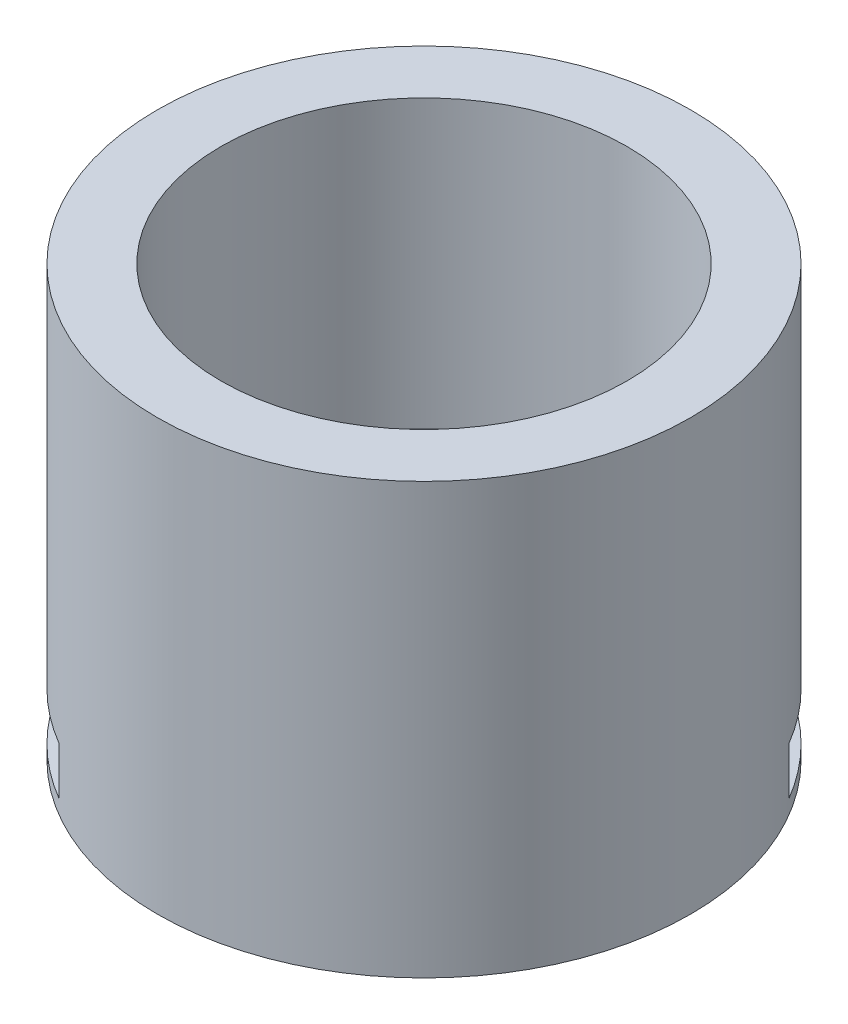
ISO-10303-21;
HEADER;
FILE_DESCRIPTION(('STEP AP214'),'2;1');
FILE_NAME('part.step','',(''),(''),'','','');
FILE_SCHEMA(('AUTOMOTIVE_DESIGN { 1 0 10303 214 1 1 1 1 }'));
ENDSEC;
DATA;
#1=APPLICATION_CONTEXT('core data for automotive mechanical design processes');
#2=APPLICATION_PROTOCOL_DEFINITION('international standard','automotive_design',2000,#1);
#3=PRODUCT_CONTEXT('',#1,'mechanical');
#4=PRODUCT('Part','Part','',(#3));
#5=PRODUCT_RELATED_PRODUCT_CATEGORY('part','',(#4));
#6=PRODUCT_DEFINITION_FORMATION('','',#4);
#7=PRODUCT_DEFINITION_CONTEXT('part definition',#1,'design');
#8=PRODUCT_DEFINITION('design','',#6,#7);
#9=PRODUCT_DEFINITION_SHAPE('','',#8);
#10=(LENGTH_UNIT() NAMED_UNIT(*) SI_UNIT(.MILLI.,.METRE.));
#11=(NAMED_UNIT(*) PLANE_ANGLE_UNIT() SI_UNIT($,.RADIAN.));
#12=(NAMED_UNIT(*) SI_UNIT($,.STERADIAN.) SOLID_ANGLE_UNIT());
#13=UNCERTAINTY_MEASURE_WITH_UNIT(LENGTH_MEASURE(1.E-05),#10,'distance_accuracy_value','');
#14=(GEOMETRIC_REPRESENTATION_CONTEXT(3) GLOBAL_UNCERTAINTY_ASSIGNED_CONTEXT((#13)) GLOBAL_UNIT_ASSIGNED_CONTEXT((#10,
#11,#12)) REPRESENTATION_CONTEXT('',''));
#15=CARTESIAN_POINT('',(0.,0.,0.));
#16=DIRECTION('',(0.,0.,1.));
#17=DIRECTION('',(1.,0.,0.));
#18=AXIS2_PLACEMENT_3D('',#15,#16,#17);
#19=CARTESIAN_POINT('',(-36.7695526217003,6.5,26.870057685089));
#20=DIRECTION('',(0.707106781186551,0.,0.707106781186544));
#21=DIRECTION('',(0.707106781186544,0.,-0.707106781186551));
#22=AXIS2_PLACEMENT_3D('',#19,#20,#21);
#23=PLANE('',#22);
#24=DIRECTION('',(0.707106781186544,0.,-0.707106781186551));
#25=VECTOR('',#24,1.);
#26=CARTESIAN_POINT('',(-36.7695526217003,6.5,26.870057685089));
#27=LINE('',#26,#25);
#28=CARTESIAN_POINT('',(-1.7677669529664,6.5,-8.13172798364529));
#29=VERTEX_POINT('',#28);
#30=CARTESIAN_POINT('',(14.1475036427833,6.5,-24.0469985793952));
#31=VERTEX_POINT('',#30);
#32=EDGE_CURVE('E163',#29,#31,#27,.T.);
#33=ORIENTED_EDGE('',*,*,#32,.F.);
#34=DIRECTION('',(0.,-1.,0.));
#35=VECTOR('',#34,1.);
#36=CARTESIAN_POINT('',(-1.7677669529664,6.5,-8.13172798364529));
#37=LINE('',#36,#35);
#38=CARTESIAN_POINT('',(-1.7677669529664,1.5,-8.13172798364531));
#39=VERTEX_POINT('',#38);
#40=EDGE_CURVE('E141',#29,#39,#37,.T.);
#41=ORIENTED_EDGE('',*,*,#40,.T.);
#42=DIRECTION('',(0.707106781186544,0.,-0.707106781186551));
#43=VECTOR('',#42,1.);
#44=CARTESIAN_POINT('',(-36.7695526217003,1.5,26.870057685089));
#45=LINE('',#44,#43);
#46=CARTESIAN_POINT('',(14.1475036427833,1.50000000000001,-24.0469985793952));
#47=VERTEX_POINT('',#46);
#48=EDGE_CURVE('E167',#39,#47,#45,.T.);
#49=ORIENTED_EDGE('',*,*,#48,.T.);
#50=DIRECTION('',(0.,-1.,0.));
#51=VECTOR('',#50,1.);
#52=CARTESIAN_POINT('',(14.1475036427833,45.,-24.0469985793952));
#53=LINE('',#52,#51);
#54=EDGE_CURVE('E213',#47,#31,#53,.F.);
#55=ORIENTED_EDGE('',*,*,#54,.T.);
#56=EDGE_LOOP('',(#33,#41,#49,#55));
#57=FACE_BOUND('',#56,.T.);
#58=ADVANCED_FACE('F34',(#57),#23,.T.);
#59=CARTESIAN_POINT('',(0.,45.,0.));
#60=DIRECTION('',(0.,-1.,0.));
#61=DIRECTION('',(0.,0.,-1.));
#62=AXIS2_PLACEMENT_3D('',#59,#60,#61);
#63=CYLINDRICAL_SURFACE('',#62,27.9);
#64=CARTESIAN_POINT('',(0.,8.50000000000001,0.));
#65=DIRECTION('',(0.,-1.,0.));
#66=DIRECTION('',(0.,0.,-1.));
#67=AXIS2_PLACEMENT_3D('',#64,#65,#66);
#68=CIRCLE('',#67,27.9);
#69=CARTESIAN_POINT('',(-22.651957402845,8.50000000000001,-16.287996372166));
#70=VERTEX_POINT('',#69);
#71=CARTESIAN_POINT('',(-16.2879963721661,8.5,-22.651957402845));
#72=VERTEX_POINT('',#71);
#73=EDGE_CURVE('E11',#70,#72,#68,.T.);
#74=ORIENTED_EDGE('',*,*,#73,.F.);
#75=DIRECTION('',(0.,-1.,0.));
#76=VECTOR('',#75,1.);
#77=CARTESIAN_POINT('',(-22.651957402845,45.,-16.287996372166));
#78=LINE('',#77,#76);
#79=CARTESIAN_POINT('',(-22.651957402845,1.50000000000001,-16.287996372166));
#80=VERTEX_POINT('',#79);
#81=EDGE_CURVE('E152',#70,#80,#78,.T.);
#82=ORIENTED_EDGE('',*,*,#81,.T.);
#83=CARTESIAN_POINT('',(0.,1.50000000000001,0.));
#84=DIRECTION('',(0.,-1.,0.));
#85=DIRECTION('',(0.,0.,-1.));
#86=AXIS2_PLACEMENT_3D('',#83,#84,#85);
#87=CIRCLE('',#86,27.9);
#88=CARTESIAN_POINT('',(-16.2879963721661,1.50000000000001,-22.651957402845));
#89=VERTEX_POINT('',#88);
#90=EDGE_CURVE('E155',#80,#89,#87,.T.);
#91=ORIENTED_EDGE('',*,*,#90,.T.);
#92=DIRECTION('',(0.,-1.,0.));
#93=VECTOR('',#92,1.);
#94=CARTESIAN_POINT('',(-16.2879963721661,45.,-22.651957402845));
#95=LINE('',#94,#93);
#96=EDGE_CURVE('E145',#72,#89,#95,.T.);
#97=ORIENTED_EDGE('',*,*,#96,.F.);
#98=EDGE_LOOP('',(#74,#82,#91,#97));
#99=FACE_BOUND('',#98,.T.);
#100=DIRECTION('',(0.,-1.,0.));
#101=VECTOR('',#100,1.);
#102=CARTESIAN_POINT('',(-24.046998579395,45.,14.1475036427836));
#103=LINE('',#102,#101);
#104=CARTESIAN_POINT('',(-24.046998579395,6.5,14.1475036427836));
#105=VERTEX_POINT('',#104);
#106=CARTESIAN_POINT('',(-24.046998579395,1.50000000000001,14.1475036427836));
#107=VERTEX_POINT('',#106);
#108=EDGE_CURVE('E222',#105,#107,#103,.T.);
#109=ORIENTED_EDGE('',*,*,#108,.F.);
#110=CARTESIAN_POINT('',(0.,6.50000000000001,0.));
#111=DIRECTION('',(0.,1.,0.));
#112=DIRECTION('',(-1.,0.,0.));
#113=AXIS2_PLACEMENT_3D('',#110,#111,#112);
#114=CIRCLE('',#113,27.9);
#115=CARTESIAN_POINT('',(-14.1475036427833,6.5,24.0469985793952));
#116=VERTEX_POINT('',#115);
#117=EDGE_CURVE('E42',#105,#116,#114,.T.);
#118=ORIENTED_EDGE('',*,*,#117,.T.);
#119=DIRECTION('',(0.,-1.,0.));
#120=VECTOR('',#119,1.);
#121=CARTESIAN_POINT('',(-14.1475036427833,45.,24.0469985793952));
#122=LINE('',#121,#120);
#123=CARTESIAN_POINT('',(-14.1475036427833,1.5,24.0469985793952));
#124=VERTEX_POINT('',#123);
#125=EDGE_CURVE('E220',#116,#124,#122,.T.);
#126=ORIENTED_EDGE('',*,*,#125,.T.);
#127=CARTESIAN_POINT('',(0.,1.50000000000001,0.));
#128=DIRECTION('',(0.,1.,0.));
#129=DIRECTION('',(-1.,0.,0.));
#130=AXIS2_PLACEMENT_3D('',#127,#128,#129);
#131=CIRCLE('',#130,27.9);
#132=EDGE_CURVE('E214',#107,#124,#131,.T.);
#133=ORIENTED_EDGE('',*,*,#132,.F.);
#134=EDGE_LOOP('',(#109,#118,#126,#133));
#135=FACE_BOUND('',#134,.T.);
#136=DIRECTION('',(0.,-1.,0.));
#137=VECTOR('',#136,1.);
#138=CARTESIAN_POINT('',(24.046998579395,45.,-14.1475036427835));
#139=LINE('',#138,#137);
#140=CARTESIAN_POINT('',(24.046998579395,1.5,-14.1475036427835));
#141=VERTEX_POINT('',#140);
#142=CARTESIAN_POINT('',(24.046998579395,6.5,-14.1475036427835));
#143=VERTEX_POINT('',#142);
#144=EDGE_CURVE('E205',#141,#143,#139,.F.);
#145=ORIENTED_EDGE('',*,*,#144,.T.);
#146=EDGE_CURVE('E217',#143,#31,#114,.T.);
#147=ORIENTED_EDGE('',*,*,#146,.T.);
#148=ORIENTED_EDGE('',*,*,#54,.F.);
#149=EDGE_CURVE('E210',#141,#47,#131,.T.);
#150=ORIENTED_EDGE('',*,*,#149,.F.);
#151=EDGE_LOOP('',(#145,#147,#148,#150));
#152=FACE_BOUND('',#151,.T.);
#153=CARTESIAN_POINT('',(0.,45.,0.));
#154=DIRECTION('',(0.,1.,0.));
#155=DIRECTION('',(0.,0.,1.));
#156=AXIS2_PLACEMENT_3D('',#153,#154,#155);
#157=CIRCLE('',#156,27.9);
#158=CARTESIAN_POINT('',(0.,45.,27.9));
#159=VERTEX_POINT('',#158);
#160=EDGE_CURVE('E202',#159,#159,#157,.T.);
#161=ORIENTED_EDGE('',*,*,#160,.F.);
#162=EDGE_LOOP('',(#161));
#163=FACE_BOUND('',#162,.T.);
#164=CARTESIAN_POINT('',(0.,0.,0.));
#165=DIRECTION('',(0.,1.,0.));
#166=DIRECTION('',(0.,0.,1.));
#167=AXIS2_PLACEMENT_3D('',#164,#165,#166);
#168=CIRCLE('',#167,27.9);
#169=CARTESIAN_POINT('',(0.,0.,27.9));
#170=VERTEX_POINT('',#169);
#171=EDGE_CURVE('E199',#170,#170,#168,.T.);
#172=ORIENTED_EDGE('',*,*,#171,.T.);
#173=EDGE_LOOP('',(#172));
#174=FACE_BOUND('',#173,.T.);
#175=ADVANCED_FACE('F36',(#99,#135,#152,#163,#174),#63,.T.);
#176=CARTESIAN_POINT('',(0.,45.,0.));
#177=DIRECTION('',(0.,1.,0.));
#178=DIRECTION('',(0.,0.,1.));
#179=AXIS2_PLACEMENT_3D('',#176,#177,#178);
#180=PLANE('',#179);
#181=CARTESIAN_POINT('',(0.,45.,0.));
#182=DIRECTION('',(0.,1.,0.));
#183=DIRECTION('',(0.,0.,1.));
#184=AXIS2_PLACEMENT_3D('',#181,#182,#183);
#185=CIRCLE('',#184,21.25);
#186=CARTESIAN_POINT('',(0.,45.,21.25));
#187=VERTEX_POINT('',#186);
#188=EDGE_CURVE('E193',#187,#187,#185,.T.);
#189=ORIENTED_EDGE('',*,*,#188,.F.);
#190=EDGE_LOOP('',(#189));
#191=FACE_BOUND('',#190,.T.);
#192=ORIENTED_EDGE('',*,*,#160,.T.);
#193=EDGE_LOOP('',(#192));
#194=FACE_BOUND('',#193,.T.);
#195=ADVANCED_FACE('F262',(#191,#194),#180,.T.);
#196=CARTESIAN_POINT('',(0.,0.,0.));
#197=DIRECTION('',(0.,1.,0.));
#198=DIRECTION('',(0.,0.,1.));
#199=AXIS2_PLACEMENT_3D('',#196,#197,#198);
#200=PLANE('',#199);
#201=CARTESIAN_POINT('',(0.,0.,19.));
#202=DIRECTION('',(0.,-1.,0.));
#203=DIRECTION('',(0.,0.,-1.));
#204=AXIS2_PLACEMENT_3D('',#201,#202,#203);
#205=CIRCLE('',#204,1.25);
#206=CARTESIAN_POINT('',(0.,0.,17.75));
#207=VERTEX_POINT('',#206);
#208=EDGE_CURVE('E176',#207,#207,#205,.T.);
#209=ORIENTED_EDGE('',*,*,#208,.F.);
#210=EDGE_LOOP('',(#209));
#211=FACE_BOUND('',#210,.T.);
#212=CARTESIAN_POINT('',(19.,0.,-1.32676290876039E-13));
#213=DIRECTION('',(0.,-1.,0.));
#214=DIRECTION('',(0.,0.,-1.));
#215=AXIS2_PLACEMENT_3D('',#212,#213,#214);
#216=CIRCLE('',#215,1.25);
#217=CARTESIAN_POINT('',(19.,0.,-1.25000000000013));
#218=VERTEX_POINT('',#217);
#219=EDGE_CURVE('E182',#218,#218,#216,.T.);
#220=ORIENTED_EDGE('',*,*,#219,.F.);
#221=EDGE_LOOP('',(#220));
#222=FACE_BOUND('',#221,.T.);
#223=CARTESIAN_POINT('',(-1.99014436314059E-13,0.,-19.));
#224=DIRECTION('',(0.,-1.,0.));
#225=DIRECTION('',(0.,0.,-1.));
#226=AXIS2_PLACEMENT_3D('',#223,#224,#225);
#227=CIRCLE('',#226,1.25);
#228=CARTESIAN_POINT('',(-1.99014436314059E-13,0.,-20.25));
#229=VERTEX_POINT('',#228);
#230=EDGE_CURVE('E162',#229,#229,#227,.T.);
#231=ORIENTED_EDGE('',*,*,#230,.F.);
#232=EDGE_LOOP('',(#231));
#233=FACE_BOUND('',#232,.T.);
#234=CARTESIAN_POINT('',(-19.,0.,0.));
#235=DIRECTION('',(0.,-1.,0.));
#236=DIRECTION('',(0.,0.,-1.));
#237=AXIS2_PLACEMENT_3D('',#234,#235,#236);
#238=CIRCLE('',#237,1.25);
#239=CARTESIAN_POINT('',(-19.,0.,-1.25));
#240=VERTEX_POINT('',#239);
#241=EDGE_CURVE('E175',#240,#240,#238,.T.);
#242=ORIENTED_EDGE('',*,*,#241,.F.);
#243=EDGE_LOOP('',(#242));
#244=FACE_BOUND('',#243,.T.);
#245=ORIENTED_EDGE('',*,*,#171,.F.);
#246=EDGE_LOOP('',(#245));
#247=FACE_BOUND('',#246,.T.);
#248=ADVANCED_FACE('F266',(#211,#222,#233,#244,#247),#200,.F.);
#249=CARTESIAN_POINT('',(0.,15.,0.));
#250=DIRECTION('',(0.,1.,0.));
#251=DIRECTION('',(0.,0.,1.));
#252=AXIS2_PLACEMENT_3D('',#249,#250,#251);
#253=CYLINDRICAL_SURFACE('',#252,21.25);
#254=CARTESIAN_POINT('',(0.,15.,0.));
#255=DIRECTION('',(0.,1.,0.));
#256=DIRECTION('',(0.,0.,1.));
#257=AXIS2_PLACEMENT_3D('',#254,#255,#256);
#258=CIRCLE('',#257,21.25);
#259=CARTESIAN_POINT('',(0.,15.,21.25));
#260=VERTEX_POINT('',#259);
#261=EDGE_CURVE('E196',#260,#260,#258,.T.);
#262=ORIENTED_EDGE('',*,*,#261,.F.);
#263=EDGE_LOOP('',(#262));
#264=FACE_BOUND('',#263,.T.);
#265=ORIENTED_EDGE('',*,*,#188,.T.);
#266=EDGE_LOOP('',(#265));
#267=FACE_BOUND('',#266,.T.);
#268=ADVANCED_FACE('F272',(#264,#267),#253,.F.);
#269=CARTESIAN_POINT('',(0.,15.,0.));
#270=DIRECTION('',(0.,1.,0.));
#271=DIRECTION('',(0.,0.,1.));
#272=AXIS2_PLACEMENT_3D('',#269,#270,#271);
#273=PLANE('',#272);
#274=ORIENTED_EDGE('',*,*,#261,.T.);
#275=EDGE_LOOP('',(#274));
#276=FACE_BOUND('',#275,.T.);
#277=ADVANCED_FACE('F279',(#276),#273,.T.);
#278=CARTESIAN_POINT('',(-19.,6.,0.));
#279=DIRECTION('',(0.,-1.,0.));
#280=DIRECTION('',(0.,0.,-1.));
#281=AXIS2_PLACEMENT_3D('',#278,#279,#280);
#282=CYLINDRICAL_SURFACE('',#281,1.25);
#283=CARTESIAN_POINT('',(-19.,6.,0.));
#284=DIRECTION('',(0.,-1.,0.));
#285=DIRECTION('',(0.,0.,-1.));
#286=AXIS2_PLACEMENT_3D('',#283,#284,#285);
#287=CIRCLE('',#286,1.25);
#288=CARTESIAN_POINT('',(-19.,6.,-1.25));
#289=VERTEX_POINT('',#288);
#290=EDGE_CURVE('E190',#289,#289,#287,.T.);
#291=ORIENTED_EDGE('',*,*,#290,.F.);
#292=EDGE_LOOP('',(#291));
#293=FACE_BOUND('',#292,.T.);
#294=ORIENTED_EDGE('',*,*,#241,.T.);
#295=EDGE_LOOP('',(#294));
#296=FACE_BOUND('',#295,.T.);
#297=ADVANCED_FACE('F283',(#293,#296),#282,.F.);
#298=CARTESIAN_POINT('',(-19.,6.,0.));
#299=DIRECTION('',(0.,-1.,0.));
#300=DIRECTION('',(0.,0.,-1.));
#301=AXIS2_PLACEMENT_3D('',#298,#299,#300);
#302=PLANE('',#301);
#303=ORIENTED_EDGE('',*,*,#290,.T.);
#304=EDGE_LOOP('',(#303));
#305=FACE_BOUND('',#304,.T.);
#306=ADVANCED_FACE('F287',(#305),#302,.T.);
#307=CARTESIAN_POINT('',(-1.99014436314059E-13,6.,-19.));
#308=DIRECTION('',(0.,-1.,0.));
#309=DIRECTION('',(0.,0.,-1.));
#310=AXIS2_PLACEMENT_3D('',#307,#308,#309);
#311=CYLINDRICAL_SURFACE('',#310,1.25);
#312=CARTESIAN_POINT('',(-1.99014436314059E-13,6.,-19.));
#313=DIRECTION('',(0.,-1.,0.));
#314=DIRECTION('',(0.,0.,-1.));
#315=AXIS2_PLACEMENT_3D('',#312,#313,#314);
#316=CIRCLE('',#315,1.25);
#317=CARTESIAN_POINT('',(-1.99014436314059E-13,6.,-20.25));
#318=VERTEX_POINT('',#317);
#319=EDGE_CURVE('E185',#318,#318,#316,.T.);
#320=ORIENTED_EDGE('',*,*,#319,.F.);
#321=EDGE_LOOP('',(#320));
#322=FACE_BOUND('',#321,.T.);
#323=ORIENTED_EDGE('',*,*,#230,.T.);
#324=EDGE_LOOP('',(#323));
#325=FACE_BOUND('',#324,.T.);
#326=ADVANCED_FACE('F291',(#322,#325),#311,.F.);
#327=CARTESIAN_POINT('',(-1.99014436314059E-13,6.,-19.));
#328=DIRECTION('',(0.,-1.,0.));
#329=DIRECTION('',(0.,0.,-1.));
#330=AXIS2_PLACEMENT_3D('',#327,#328,#329);
#331=PLANE('',#330);
#332=ORIENTED_EDGE('',*,*,#319,.T.);
#333=EDGE_LOOP('',(#332));
#334=FACE_BOUND('',#333,.T.);
#335=ADVANCED_FACE('F295',(#334),#331,.T.);
#336=CARTESIAN_POINT('',(19.,6.,-1.32676290876039E-13));
#337=DIRECTION('',(0.,-1.,0.));
#338=DIRECTION('',(0.,0.,-1.));
#339=AXIS2_PLACEMENT_3D('',#336,#337,#338);
#340=CYLINDRICAL_SURFACE('',#339,1.25);
#341=CARTESIAN_POINT('',(19.,6.,-1.32676290876039E-13));
#342=DIRECTION('',(0.,-1.,0.));
#343=DIRECTION('',(0.,0.,-1.));
#344=AXIS2_PLACEMENT_3D('',#341,#342,#343);
#345=CIRCLE('',#344,1.25);
#346=CARTESIAN_POINT('',(19.,6.,-1.25000000000013));
#347=VERTEX_POINT('',#346);
#348=EDGE_CURVE('E179',#347,#347,#345,.T.);
#349=ORIENTED_EDGE('',*,*,#348,.F.);
#350=EDGE_LOOP('',(#349));
#351=FACE_BOUND('',#350,.T.);
#352=ORIENTED_EDGE('',*,*,#219,.T.);
#353=EDGE_LOOP('',(#352));
#354=FACE_BOUND('',#353,.T.);
#355=ADVANCED_FACE('F299',(#351,#354),#340,.F.);
#356=CARTESIAN_POINT('',(19.,6.,-1.32676290876039E-13));
#357=DIRECTION('',(0.,-1.,0.));
#358=DIRECTION('',(0.,0.,-1.));
#359=AXIS2_PLACEMENT_3D('',#356,#357,#358);
#360=PLANE('',#359);
#361=ORIENTED_EDGE('',*,*,#348,.T.);
#362=EDGE_LOOP('',(#361));
#363=FACE_BOUND('',#362,.T.);
#364=ADVANCED_FACE('F303',(#363),#360,.T.);
#365=CARTESIAN_POINT('',(0.,6.,19.));
#366=DIRECTION('',(0.,-1.,0.));
#367=DIRECTION('',(0.,0.,-1.));
#368=AXIS2_PLACEMENT_3D('',#365,#366,#367);
#369=CYLINDRICAL_SURFACE('',#368,1.25);
#370=CARTESIAN_POINT('',(0.,6.,19.));
#371=DIRECTION('',(0.,-1.,0.));
#372=DIRECTION('',(0.,0.,-1.));
#373=AXIS2_PLACEMENT_3D('',#370,#371,#372);
#374=CIRCLE('',#373,1.25);
#375=CARTESIAN_POINT('',(0.,6.,17.75));
#376=VERTEX_POINT('',#375);
#377=EDGE_CURVE('E172',#376,#376,#374,.T.);
#378=ORIENTED_EDGE('',*,*,#377,.F.);
#379=EDGE_LOOP('',(#378));
#380=FACE_BOUND('',#379,.T.);
#381=ORIENTED_EDGE('',*,*,#208,.T.);
#382=EDGE_LOOP('',(#381));
#383=FACE_BOUND('',#382,.T.);
#384=ADVANCED_FACE('F307',(#380,#383),#369,.F.);
#385=CARTESIAN_POINT('',(0.,6.,19.));
#386=DIRECTION('',(0.,-1.,0.));
#387=DIRECTION('',(0.,0.,-1.));
#388=AXIS2_PLACEMENT_3D('',#385,#386,#387);
#389=PLANE('',#388);
#390=ORIENTED_EDGE('',*,*,#377,.T.);
#391=EDGE_LOOP('',(#390));
#392=FACE_BOUND('',#391,.T.);
#393=ADVANCED_FACE('F255',(#392),#389,.T.);
#394=CARTESIAN_POINT('',(-36.7695526217003,6.5,26.870057685089));
#395=DIRECTION('',(0.,1.,0.));
#396=DIRECTION('',(-1.,0.,0.));
#397=AXIS2_PLACEMENT_3D('',#394,#395,#396);
#398=PLANE('',#397);
#399=CARTESIAN_POINT('',(-8.13172798364529,6.5,-1.76776695296634));
#400=VERTEX_POINT('',#399);
#401=EDGE_CURVE('E159',#105,#400,#27,.T.);
#402=ORIENTED_EDGE('',*,*,#401,.T.);
#403=DIRECTION('',(0.707106781186549,0.,0.707106781186546));
#404=VECTOR('',#403,1.);
#405=CARTESIAN_POINT('',(-8.13172798364519,6.5,-1.76776695296624));
#406=LINE('',#405,#404);
#407=CARTESIAN_POINT('',(-3.18198051533946,6.5,3.18198051533947));
#408=VERTEX_POINT('',#407);
#409=EDGE_CURVE('E149',#400,#408,#406,.T.);
#410=ORIENTED_EDGE('',*,*,#409,.T.);
#411=DIRECTION('',(0.707106781186546,0.,-0.707106781186549));
#412=VECTOR('',#411,1.);
#413=CARTESIAN_POINT('',(-31.8198051533946,6.5,31.8198051533947));
#414=LINE('',#413,#412);
#415=CARTESIAN_POINT('',(3.18198051533946,6.5,-3.18198051533947));
#416=VERTEX_POINT('',#415);
#417=EDGE_CURVE('E136',#408,#416,#414,.T.);
#418=ORIENTED_EDGE('',*,*,#417,.T.);
#419=DIRECTION('',(0.707106781186549,0.,0.707106781186546));
#420=VECTOR('',#419,1.);
#421=CARTESIAN_POINT('',(-1.76776695296628,6.5,-8.13172798364517));
#422=LINE('',#421,#420);
#423=EDGE_CURVE('E132',#29,#416,#422,.T.);
#424=ORIENTED_EDGE('',*,*,#423,.F.);
#425=ORIENTED_EDGE('',*,*,#32,.T.);
#426=ORIENTED_EDGE('',*,*,#146,.F.);
#427=DIRECTION('',(0.707106781186544,0.,-0.707106781186551));
#428=VECTOR('',#427,1.);
#429=CARTESIAN_POINT('',(-26.8700576850886,6.5,36.7695526217006));
#430=LINE('',#429,#428);
#431=EDGE_CURVE('E158',#116,#143,#430,.T.);
#432=ORIENTED_EDGE('',*,*,#431,.F.);
#433=ORIENTED_EDGE('',*,*,#117,.F.);
#434=EDGE_LOOP('',(#402,#410,#418,#424,#425,#426,#432,#433));
#435=FACE_BOUND('',#434,.T.);
#436=ADVANCED_FACE('F238',(#435),#398,.F.);
#437=DIRECTION('',(0.,-1.,0.));
#438=VECTOR('',#437,1.);
#439=CARTESIAN_POINT('',(-8.13172798364529,6.50000000000001,-1.76776695296634));
#440=LINE('',#439,#438);
#441=CARTESIAN_POINT('',(-8.13172798364529,1.5,-1.76776695296633));
#442=VERTEX_POINT('',#441);
#443=EDGE_CURVE('E147',#400,#442,#440,.T.);
#444=ORIENTED_EDGE('',*,*,#443,.F.);
#445=ORIENTED_EDGE('',*,*,#401,.F.);
#446=ORIENTED_EDGE('',*,*,#108,.T.);
#447=EDGE_CURVE('E164',#107,#442,#45,.T.);
#448=ORIENTED_EDGE('',*,*,#447,.T.);
#449=EDGE_LOOP('',(#444,#445,#446,#448));
#450=FACE_BOUND('',#449,.T.);
#451=ADVANCED_FACE('F247',(#450),#23,.T.);
#452=CARTESIAN_POINT('',(-36.7695526217003,1.5,26.870057685089));
#453=DIRECTION('',(0.,1.,0.));
#454=DIRECTION('',(-1.,0.,0.));
#455=AXIS2_PLACEMENT_3D('',#452,#453,#454);
#456=PLANE('',#455);
#457=ORIENTED_EDGE('',*,*,#48,.F.);
#458=DIRECTION('',(0.707106781186549,0.,0.707106781186546));
#459=VECTOR('',#458,1.);
#460=CARTESIAN_POINT('',(-60.4576297914499,1.5,-66.8215908221286));
#461=LINE('',#460,#459);
#462=EDGE_CURVE('E49',#89,#39,#461,.T.);
#463=ORIENTED_EDGE('',*,*,#462,.F.);
#464=ORIENTED_EDGE('',*,*,#90,.F.);
#465=DIRECTION('',(0.707106781186549,0.,0.707106781186546));
#466=VECTOR('',#465,1.);
#467=CARTESIAN_POINT('',(-66.8215908221288,1.5,-60.4576297914497));
#468=LINE('',#467,#466);
#469=EDGE_CURVE('E55',#80,#442,#468,.T.);
#470=ORIENTED_EDGE('',*,*,#469,.T.);
#471=ORIENTED_EDGE('',*,*,#447,.F.);
#472=ORIENTED_EDGE('',*,*,#132,.T.);
#473=DIRECTION('',(0.707106781186544,0.,-0.707106781186551));
#474=VECTOR('',#473,1.);
#475=CARTESIAN_POINT('',(-26.8700576850886,1.5,36.7695526217006));
#476=LINE('',#475,#474);
#477=EDGE_CURVE('E168',#124,#141,#476,.T.);
#478=ORIENTED_EDGE('',*,*,#477,.T.);
#479=ORIENTED_EDGE('',*,*,#149,.T.);
#480=EDGE_LOOP('',(#457,#463,#464,#470,#471,#472,#478,#479));
#481=FACE_BOUND('',#480,.T.);
#482=ADVANCED_FACE('F229',(#481),#456,.T.);
#483=CARTESIAN_POINT('',(-26.8700576850886,6.5,36.7695526217006));
#484=DIRECTION('',(0.707106781186551,0.,0.707106781186544));
#485=DIRECTION('',(0.707106781186544,0.,-0.707106781186551));
#486=AXIS2_PLACEMENT_3D('',#483,#484,#485);
#487=PLANE('',#486);
#488=ORIENTED_EDGE('',*,*,#431,.T.);
#489=ORIENTED_EDGE('',*,*,#144,.F.);
#490=ORIENTED_EDGE('',*,*,#477,.F.);
#491=ORIENTED_EDGE('',*,*,#125,.F.);
#492=EDGE_LOOP('',(#488,#489,#490,#491));
#493=FACE_BOUND('',#492,.T.);
#494=ADVANCED_FACE('F235',(#493),#487,.F.);
#495=CARTESIAN_POINT('',(-66.8215908221288,8.5,-60.4576297914497));
#496=DIRECTION('',(0.,-1.,0.));
#497=DIRECTION('',(0.,0.,-1.));
#498=AXIS2_PLACEMENT_3D('',#495,#496,#497);
#499=PLANE('',#498);
#500=ORIENTED_EDGE('',*,*,#73,.T.);
#501=DIRECTION('',(0.707106781186549,0.,0.707106781186546));
#502=VECTOR('',#501,1.);
#503=CARTESIAN_POINT('',(-60.4576297914499,8.5,-66.8215908221286));
#504=LINE('',#503,#502);
#505=CARTESIAN_POINT('',(3.18198051533946,8.5,-3.18198051533947));
#506=VERTEX_POINT('',#505);
#507=EDGE_CURVE('E110',#72,#506,#504,.T.);
#508=ORIENTED_EDGE('',*,*,#507,.T.);
#509=DIRECTION('',(0.707106781186546,0.,-0.707106781186549));
#510=VECTOR('',#509,1.);
#511=CARTESIAN_POINT('',(-3.18198051533946,8.5,3.18198051533947));
#512=LINE('',#511,#510);
#513=CARTESIAN_POINT('',(-3.18198051533946,8.5,3.18198051533947));
#514=VERTEX_POINT('',#513);
#515=EDGE_CURVE('E114',#514,#506,#512,.T.);
#516=ORIENTED_EDGE('',*,*,#515,.F.);
#517=DIRECTION('',(0.707106781186549,0.,0.707106781186546));
#518=VECTOR('',#517,1.);
#519=CARTESIAN_POINT('',(-66.8215908221288,8.5,-60.4576297914497));
#520=LINE('',#519,#518);
#521=EDGE_CURVE('E120',#70,#514,#520,.T.);
#522=ORIENTED_EDGE('',*,*,#521,.F.);
#523=EDGE_LOOP('',(#500,#508,#516,#522));
#524=FACE_BOUND('',#523,.T.);
#525=ADVANCED_FACE('F112',(#524),#499,.T.);
#526=CARTESIAN_POINT('',(-66.8215908221288,8.5,-60.4576297914497));
#527=DIRECTION('',(-0.707106781186546,0.,0.707106781186549));
#528=DIRECTION('',(0.707106781186549,0.,0.707106781186546));
#529=AXIS2_PLACEMENT_3D('',#526,#527,#528);
#530=PLANE('',#529);
#531=ORIENTED_EDGE('',*,*,#521,.T.);
#532=DIRECTION('',(0.,-1.,0.));
#533=VECTOR('',#532,1.);
#534=CARTESIAN_POINT('',(-3.18198051533946,8.5,3.18198051533947));
#535=LINE('',#534,#533);
#536=EDGE_CURVE('E128',#514,#408,#535,.T.);
#537=ORIENTED_EDGE('',*,*,#536,.T.);
#538=ORIENTED_EDGE('',*,*,#409,.F.);
#539=ORIENTED_EDGE('',*,*,#443,.T.);
#540=ORIENTED_EDGE('',*,*,#469,.F.);
#541=ORIENTED_EDGE('',*,*,#81,.F.);
#542=EDGE_LOOP('',(#531,#537,#538,#539,#540,#541));
#543=FACE_BOUND('',#542,.T.);
#544=ADVANCED_FACE('F244',(#543),#530,.F.);
#545=CARTESIAN_POINT('',(-60.4576297914499,8.5,-66.8215908221286));
#546=DIRECTION('',(-0.707106781186546,0.,0.707106781186549));
#547=DIRECTION('',(0.707106781186549,0.,0.707106781186546));
#548=AXIS2_PLACEMENT_3D('',#545,#546,#547);
#549=PLANE('',#548);
#550=ORIENTED_EDGE('',*,*,#96,.T.);
#551=ORIENTED_EDGE('',*,*,#462,.T.);
#552=ORIENTED_EDGE('',*,*,#40,.F.);
#553=ORIENTED_EDGE('',*,*,#423,.T.);
#554=DIRECTION('',(0.,-1.,0.));
#555=VECTOR('',#554,1.);
#556=CARTESIAN_POINT('',(3.18198051533946,8.5,-3.18198051533947));
#557=LINE('',#556,#555);
#558=EDGE_CURVE('E125',#506,#416,#557,.T.);
#559=ORIENTED_EDGE('',*,*,#558,.F.);
#560=ORIENTED_EDGE('',*,*,#507,.F.);
#561=EDGE_LOOP('',(#550,#551,#552,#553,#559,#560));
#562=FACE_BOUND('',#561,.T.);
#563=ADVANCED_FACE('F130',(#562),#549,.T.);
#564=CARTESIAN_POINT('',(0.,0.,0.));
#565=DIRECTION('',(0.707106781186549,0.,0.707106781186546));
#566=DIRECTION('',(0.707106781186546,0.,-0.707106781186549));
#567=AXIS2_PLACEMENT_3D('',#564,#565,#566);
#568=PLANE('',#567);
#569=ORIENTED_EDGE('',*,*,#536,.F.);
#570=ORIENTED_EDGE('',*,*,#515,.T.);
#571=ORIENTED_EDGE('',*,*,#558,.T.);
#572=ORIENTED_EDGE('',*,*,#417,.F.);
#573=EDGE_LOOP('',(#569,#570,#571,#572));
#574=FACE_BOUND('',#573,.T.);
#575=ADVANCED_FACE('F124',(#574),#568,.F.);
#576=CLOSED_SHELL('',(#58,#175,#195,#248,#268,#277,#297,#306,#326,#335,#355,#364,#384,#393,#436,
#451,#482,#494,#525,#544,#563,#575));
#577=MANIFOLD_SOLID_BREP('B2',#576);
#578=ADVANCED_BREP_SHAPE_REPRESENTATION('',(#18,#577),#14);
#579=SHAPE_DEFINITION_REPRESENTATION(#9,#578);
ENDSEC;
END-ISO-10303-21;
